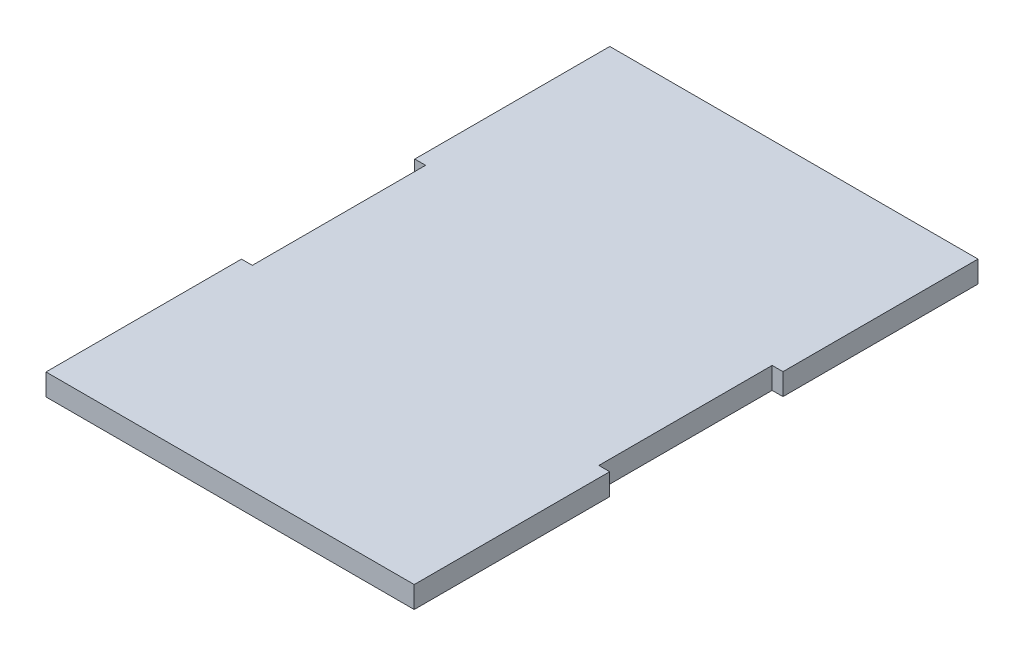
ISO-10303-21;
HEADER;
FILE_DESCRIPTION(('STEP AP214'),'2;1');
FILE_NAME('part.step','',(''),(''),'','','');
FILE_SCHEMA(('AUTOMOTIVE_DESIGN { 1 0 10303 214 1 1 1 1 }'));
ENDSEC;
DATA;
#1=APPLICATION_CONTEXT('core data for automotive mechanical design processes');
#2=APPLICATION_PROTOCOL_DEFINITION('international standard','automotive_design',2000,#1);
#3=PRODUCT_CONTEXT('',#1,'mechanical');
#4=PRODUCT('Part','Part','',(#3));
#5=PRODUCT_RELATED_PRODUCT_CATEGORY('part','',(#4));
#6=PRODUCT_DEFINITION_FORMATION('','',#4);
#7=PRODUCT_DEFINITION_CONTEXT('part definition',#1,'design');
#8=PRODUCT_DEFINITION('design','',#6,#7);
#9=PRODUCT_DEFINITION_SHAPE('','',#8);
#10=(LENGTH_UNIT() NAMED_UNIT(*) SI_UNIT(.MILLI.,.METRE.));
#11=(NAMED_UNIT(*) PLANE_ANGLE_UNIT() SI_UNIT($,.RADIAN.));
#12=(NAMED_UNIT(*) SI_UNIT($,.STERADIAN.) SOLID_ANGLE_UNIT());
#13=UNCERTAINTY_MEASURE_WITH_UNIT(LENGTH_MEASURE(1.E-05),#10,'distance_accuracy_value','');
#14=(GEOMETRIC_REPRESENTATION_CONTEXT(3) GLOBAL_UNCERTAINTY_ASSIGNED_CONTEXT((#13)) GLOBAL_UNIT_ASSIGNED_CONTEXT((#10,
#11,#12)) REPRESENTATION_CONTEXT('',''));
#15=CARTESIAN_POINT('',(0.,0.,0.));
#16=DIRECTION('',(0.,0.,1.));
#17=DIRECTION('',(1.,0.,0.));
#18=AXIS2_PLACEMENT_3D('',#15,#16,#17);
#19=CARTESIAN_POINT('',(0.,1.5875,-6.365875));
#20=DIRECTION('',(0.,0.,1.));
#21=DIRECTION('',(1.,0.,0.));
#22=AXIS2_PLACEMENT_3D('',#19,#20,#21);
#23=PLANE('',#22);
#24=DIRECTION('',(-1.,0.,0.));
#25=VECTOR('',#24,1.);
#26=CARTESIAN_POINT('',(0.,0.,-6.365875));
#27=LINE('',#26,#25);
#28=CARTESIAN_POINT('',(13.49375,0.,-6.365875));
#29=VERTEX_POINT('',#28);
#30=CARTESIAN_POINT('',(12.7,0.,-6.365875));
#31=VERTEX_POINT('',#30);
#32=EDGE_CURVE('E166',#29,#31,#27,.T.);
#33=ORIENTED_EDGE('',*,*,#32,.F.);
#34=DIRECTION('',(0.,-1.,0.));
#35=VECTOR('',#34,1.);
#36=CARTESIAN_POINT('',(13.49375,1.5875,-6.365875));
#37=LINE('',#36,#35);
#38=CARTESIAN_POINT('',(13.49375,1.5875,-6.365875));
#39=VERTEX_POINT('',#38);
#40=EDGE_CURVE('E11',#39,#29,#37,.T.);
#41=ORIENTED_EDGE('',*,*,#40,.F.);
#42=DIRECTION('',(-1.,0.,0.));
#43=VECTOR('',#42,1.);
#44=CARTESIAN_POINT('',(0.,1.5875,-6.365875));
#45=LINE('',#44,#43);
#46=CARTESIAN_POINT('',(12.7,1.5875,-6.365875));
#47=VERTEX_POINT('',#46);
#48=EDGE_CURVE('E203',#39,#47,#45,.T.);
#49=ORIENTED_EDGE('',*,*,#48,.T.);
#50=DIRECTION('',(0.,-1.,0.));
#51=VECTOR('',#50,1.);
#52=CARTESIAN_POINT('',(12.7,1.5875,-6.365875));
#53=LINE('',#52,#51);
#54=EDGE_CURVE('E105',#47,#31,#53,.T.);
#55=ORIENTED_EDGE('',*,*,#54,.T.);
#56=EDGE_LOOP('',(#33,#41,#49,#55));
#57=FACE_BOUND('',#56,.T.);
#58=ADVANCED_FACE('F41',(#57),#23,.T.);
#59=CARTESIAN_POINT('',(13.49375,1.5875,0.));
#60=DIRECTION('',(-1.,0.,0.));
#61=DIRECTION('',(0.,0.,1.));
#62=AXIS2_PLACEMENT_3D('',#59,#60,#61);
#63=PLANE('',#62);
#64=DIRECTION('',(0.,0.,-1.));
#65=VECTOR('',#64,1.);
#66=CARTESIAN_POINT('',(13.49375,0.,0.));
#67=LINE('',#66,#65);
#68=CARTESIAN_POINT('',(13.49375,0.,-20.659725));
#69=VERTEX_POINT('',#68);
#70=EDGE_CURVE('E170',#29,#69,#67,.T.);
#71=ORIENTED_EDGE('',*,*,#70,.T.);
#72=DIRECTION('',(0.,-1.,0.));
#73=VECTOR('',#72,1.);
#74=CARTESIAN_POINT('',(13.49375,1.5875,-20.659725));
#75=LINE('',#74,#73);
#76=CARTESIAN_POINT('',(13.49375,1.5875,-20.659725));
#77=VERTEX_POINT('',#76);
#78=EDGE_CURVE('E50',#77,#69,#75,.T.);
#79=ORIENTED_EDGE('',*,*,#78,.F.);
#80=DIRECTION('',(0.,0.,-1.));
#81=VECTOR('',#80,1.);
#82=CARTESIAN_POINT('',(13.49375,1.5875,0.));
#83=LINE('',#82,#81);
#84=EDGE_CURVE('E149',#39,#77,#83,.T.);
#85=ORIENTED_EDGE('',*,*,#84,.F.);
#86=ORIENTED_EDGE('',*,*,#40,.T.);
#87=EDGE_LOOP('',(#71,#79,#85,#86));
#88=FACE_BOUND('',#87,.T.);
#89=ADVANCED_FACE('F237',(#88),#63,.F.);
#90=CARTESIAN_POINT('',(0.,1.5875,-20.659725));
#91=DIRECTION('',(0.,0.,-1.));
#92=DIRECTION('',(-1.,0.,0.));
#93=AXIS2_PLACEMENT_3D('',#90,#91,#92);
#94=PLANE('',#93);
#95=DIRECTION('',(1.,0.,0.));
#96=VECTOR('',#95,1.);
#97=CARTESIAN_POINT('',(0.,0.,-20.659725));
#98=LINE('',#97,#96);
#99=CARTESIAN_POINT('',(-13.49375,0.,-20.659725));
#100=VERTEX_POINT('',#99);
#101=EDGE_CURVE('E174',#100,#69,#98,.T.);
#102=ORIENTED_EDGE('',*,*,#101,.F.);
#103=DIRECTION('',(0.,-1.,0.));
#104=VECTOR('',#103,1.);
#105=CARTESIAN_POINT('',(-13.49375,1.5875,-20.659725));
#106=LINE('',#105,#104);
#107=CARTESIAN_POINT('',(-13.49375,1.5875,-20.659725));
#108=VERTEX_POINT('',#107);
#109=EDGE_CURVE('E225',#108,#100,#106,.T.);
#110=ORIENTED_EDGE('',*,*,#109,.F.);
#111=DIRECTION('',(1.,0.,0.));
#112=VECTOR('',#111,1.);
#113=CARTESIAN_POINT('',(0.,1.5875,-20.659725));
#114=LINE('',#113,#112);
#115=EDGE_CURVE('E234',#108,#77,#114,.T.);
#116=ORIENTED_EDGE('',*,*,#115,.T.);
#117=ORIENTED_EDGE('',*,*,#78,.T.);
#118=EDGE_LOOP('',(#102,#110,#116,#117));
#119=FACE_BOUND('',#118,.T.);
#120=ADVANCED_FACE('F232',(#119),#94,.T.);
#121=CARTESIAN_POINT('',(-13.49375,1.5875,0.));
#122=DIRECTION('',(-1.,0.,0.));
#123=DIRECTION('',(0.,0.,1.));
#124=AXIS2_PLACEMENT_3D('',#121,#122,#123);
#125=PLANE('',#124);
#126=DIRECTION('',(0.,0.,-1.));
#127=VECTOR('',#126,1.);
#128=CARTESIAN_POINT('',(-13.49375,0.,0.));
#129=LINE('',#128,#127);
#130=CARTESIAN_POINT('',(-13.49375,0.,-6.365875));
#131=VERTEX_POINT('',#130);
#132=EDGE_CURVE('E178',#131,#100,#129,.T.);
#133=ORIENTED_EDGE('',*,*,#132,.F.);
#134=DIRECTION('',(0.,-1.,0.));
#135=VECTOR('',#134,1.);
#136=CARTESIAN_POINT('',(-13.49375,1.5875,-6.365875));
#137=LINE('',#136,#135);
#138=CARTESIAN_POINT('',(-13.49375,1.5875,-6.365875));
#139=VERTEX_POINT('',#138);
#140=EDGE_CURVE('E222',#139,#131,#137,.T.);
#141=ORIENTED_EDGE('',*,*,#140,.F.);
#142=DIRECTION('',(0.,0.,-1.));
#143=VECTOR('',#142,1.);
#144=CARTESIAN_POINT('',(-13.49375,1.5875,0.));
#145=LINE('',#144,#143);
#146=EDGE_CURVE('E247',#139,#108,#145,.T.);
#147=ORIENTED_EDGE('',*,*,#146,.T.);
#148=ORIENTED_EDGE('',*,*,#109,.T.);
#149=EDGE_LOOP('',(#133,#141,#147,#148));
#150=FACE_BOUND('',#149,.T.);
#151=ADVANCED_FACE('F243',(#150),#125,.T.);
#152=CARTESIAN_POINT('',(0.,1.5875,-6.365875));
#153=DIRECTION('',(0.,0.,-1.));
#154=DIRECTION('',(-1.,0.,0.));
#155=AXIS2_PLACEMENT_3D('',#152,#153,#154);
#156=PLANE('',#155);
#157=DIRECTION('',(1.,0.,0.));
#158=VECTOR('',#157,1.);
#159=CARTESIAN_POINT('',(0.,0.,-6.365875));
#160=LINE('',#159,#158);
#161=CARTESIAN_POINT('',(-12.7,0.,-6.365875));
#162=VERTEX_POINT('',#161);
#163=EDGE_CURVE('E182',#131,#162,#160,.T.);
#164=ORIENTED_EDGE('',*,*,#163,.T.);
#165=DIRECTION('',(0.,-1.,0.));
#166=VECTOR('',#165,1.);
#167=CARTESIAN_POINT('',(-12.7,1.5875,-6.365875));
#168=LINE('',#167,#166);
#169=CARTESIAN_POINT('',(-12.7,1.5875,-6.365875));
#170=VERTEX_POINT('',#169);
#171=EDGE_CURVE('E219',#170,#162,#168,.T.);
#172=ORIENTED_EDGE('',*,*,#171,.F.);
#173=DIRECTION('',(1.,0.,0.));
#174=VECTOR('',#173,1.);
#175=CARTESIAN_POINT('',(0.,1.5875,-6.365875));
#176=LINE('',#175,#174);
#177=EDGE_CURVE('E252',#139,#170,#176,.T.);
#178=ORIENTED_EDGE('',*,*,#177,.F.);
#179=ORIENTED_EDGE('',*,*,#140,.T.);
#180=EDGE_LOOP('',(#164,#172,#178,#179));
#181=FACE_BOUND('',#180,.T.);
#182=ADVANCED_FACE('F312',(#181),#156,.F.);
#183=CARTESIAN_POINT('',(-12.7,1.5875,0.));
#184=DIRECTION('',(-1.,0.,0.));
#185=DIRECTION('',(0.,0.,1.));
#186=AXIS2_PLACEMENT_3D('',#183,#184,#185);
#187=PLANE('',#186);
#188=DIRECTION('',(0.,0.,-1.));
#189=VECTOR('',#188,1.);
#190=CARTESIAN_POINT('',(-12.7,0.,0.));
#191=LINE('',#190,#189);
#192=CARTESIAN_POINT('',(-12.7,0.,6.334125));
#193=VERTEX_POINT('',#192);
#194=EDGE_CURVE('E187',#193,#162,#191,.T.);
#195=ORIENTED_EDGE('',*,*,#194,.F.);
#196=DIRECTION('',(0.,-1.,0.));
#197=VECTOR('',#196,1.);
#198=CARTESIAN_POINT('',(-12.7,1.5875,6.334125));
#199=LINE('',#198,#197);
#200=CARTESIAN_POINT('',(-12.7,1.5875,6.334125));
#201=VERTEX_POINT('',#200);
#202=EDGE_CURVE('E216',#201,#193,#199,.T.);
#203=ORIENTED_EDGE('',*,*,#202,.F.);
#204=DIRECTION('',(0.,0.,-1.));
#205=VECTOR('',#204,1.);
#206=CARTESIAN_POINT('',(-12.7,1.5875,0.));
#207=LINE('',#206,#205);
#208=EDGE_CURVE('E259',#201,#170,#207,.T.);
#209=ORIENTED_EDGE('',*,*,#208,.T.);
#210=ORIENTED_EDGE('',*,*,#171,.T.);
#211=EDGE_LOOP('',(#195,#203,#209,#210));
#212=FACE_BOUND('',#211,.T.);
#213=ADVANCED_FACE('F278',(#212),#187,.T.);
#214=CARTESIAN_POINT('',(0.,1.5875,6.334125));
#215=DIRECTION('',(0.,0.,-1.));
#216=DIRECTION('',(-1.,0.,0.));
#217=AXIS2_PLACEMENT_3D('',#214,#215,#216);
#218=PLANE('',#217);
#219=DIRECTION('',(1.,0.,0.));
#220=VECTOR('',#219,1.);
#221=CARTESIAN_POINT('',(0.,0.,6.334125));
#222=LINE('',#221,#220);
#223=CARTESIAN_POINT('',(-13.49375,0.,6.334125));
#224=VERTEX_POINT('',#223);
#225=EDGE_CURVE('E191',#224,#193,#222,.T.);
#226=ORIENTED_EDGE('',*,*,#225,.F.);
#227=DIRECTION('',(0.,-1.,0.));
#228=VECTOR('',#227,1.);
#229=CARTESIAN_POINT('',(-13.49375,1.5875,6.334125));
#230=LINE('',#229,#228);
#231=CARTESIAN_POINT('',(-13.49375,1.5875,6.334125));
#232=VERTEX_POINT('',#231);
#233=EDGE_CURVE('E213',#232,#224,#230,.T.);
#234=ORIENTED_EDGE('',*,*,#233,.F.);
#235=DIRECTION('',(1.,0.,0.));
#236=VECTOR('',#235,1.);
#237=CARTESIAN_POINT('',(0.,1.5875,6.334125));
#238=LINE('',#237,#236);
#239=EDGE_CURVE('E262',#232,#201,#238,.T.);
#240=ORIENTED_EDGE('',*,*,#239,.T.);
#241=ORIENTED_EDGE('',*,*,#202,.T.);
#242=EDGE_LOOP('',(#226,#234,#240,#241));
#243=FACE_BOUND('',#242,.T.);
#244=ADVANCED_FACE('F279',(#243),#218,.T.);
#245=CARTESIAN_POINT('',(-13.49375,0.,20.659725));
#246=VERTEX_POINT('',#245);
#247=EDGE_CURVE('E183',#246,#224,#129,.T.);
#248=ORIENTED_EDGE('',*,*,#247,.F.);
#249=DIRECTION('',(0.,-1.,0.));
#250=VECTOR('',#249,1.);
#251=CARTESIAN_POINT('',(-13.49375,1.5875,20.659725));
#252=LINE('',#251,#250);
#253=CARTESIAN_POINT('',(-13.49375,1.5875,20.659725));
#254=VERTEX_POINT('',#253);
#255=EDGE_CURVE('E210',#254,#246,#252,.T.);
#256=ORIENTED_EDGE('',*,*,#255,.F.);
#257=EDGE_CURVE('E254',#254,#232,#145,.T.);
#258=ORIENTED_EDGE('',*,*,#257,.T.);
#259=ORIENTED_EDGE('',*,*,#233,.T.);
#260=EDGE_LOOP('',(#248,#256,#258,#259));
#261=FACE_BOUND('',#260,.T.);
#262=ADVANCED_FACE('F272',(#261),#125,.T.);
#263=CARTESIAN_POINT('',(0.,1.5875,20.659725));
#264=DIRECTION('',(0.,0.,-1.));
#265=DIRECTION('',(-1.,0.,0.));
#266=AXIS2_PLACEMENT_3D('',#263,#264,#265);
#267=PLANE('',#266);
#268=DIRECTION('',(1.,0.,0.));
#269=VECTOR('',#268,1.);
#270=CARTESIAN_POINT('',(0.,0.,20.659725));
#271=LINE('',#270,#269);
#272=CARTESIAN_POINT('',(13.49375,0.,20.659725));
#273=VERTEX_POINT('',#272);
#274=EDGE_CURVE('E195',#246,#273,#271,.T.);
#275=ORIENTED_EDGE('',*,*,#274,.T.);
#276=DIRECTION('',(0.,-1.,0.));
#277=VECTOR('',#276,1.);
#278=CARTESIAN_POINT('',(13.49375,1.5875,20.659725));
#279=LINE('',#278,#277);
#280=CARTESIAN_POINT('',(13.49375,1.5875,20.659725));
#281=VERTEX_POINT('',#280);
#282=EDGE_CURVE('E155',#281,#273,#279,.T.);
#283=ORIENTED_EDGE('',*,*,#282,.F.);
#284=DIRECTION('',(1.,0.,0.));
#285=VECTOR('',#284,1.);
#286=CARTESIAN_POINT('',(0.,1.5875,20.659725));
#287=LINE('',#286,#285);
#288=EDGE_CURVE('E143',#254,#281,#287,.T.);
#289=ORIENTED_EDGE('',*,*,#288,.F.);
#290=ORIENTED_EDGE('',*,*,#255,.T.);
#291=EDGE_LOOP('',(#275,#283,#289,#290));
#292=FACE_BOUND('',#291,.T.);
#293=ADVANCED_FACE('F296',(#292),#267,.F.);
#294=CARTESIAN_POINT('',(13.49375,0.,6.334125));
#295=VERTEX_POINT('',#294);
#296=EDGE_CURVE('E153',#273,#295,#67,.T.);
#297=ORIENTED_EDGE('',*,*,#296,.T.);
#298=DIRECTION('',(0.,-1.,0.));
#299=VECTOR('',#298,1.);
#300=CARTESIAN_POINT('',(13.49375,1.5875,6.334125));
#301=LINE('',#300,#299);
#302=CARTESIAN_POINT('',(13.49375,1.5875,6.334125));
#303=VERTEX_POINT('',#302);
#304=EDGE_CURVE('E150',#303,#295,#301,.T.);
#305=ORIENTED_EDGE('',*,*,#304,.F.);
#306=EDGE_CURVE('E136',#281,#303,#83,.T.);
#307=ORIENTED_EDGE('',*,*,#306,.F.);
#308=ORIENTED_EDGE('',*,*,#282,.T.);
#309=EDGE_LOOP('',(#297,#305,#307,#308));
#310=FACE_BOUND('',#309,.T.);
#311=ADVANCED_FACE('F151',(#310),#63,.F.);
#312=CARTESIAN_POINT('',(0.,1.5875,6.334125));
#313=DIRECTION('',(0.,0.,1.));
#314=DIRECTION('',(1.,0.,0.));
#315=AXIS2_PLACEMENT_3D('',#312,#313,#314);
#316=PLANE('',#315);
#317=DIRECTION('',(-1.,0.,0.));
#318=VECTOR('',#317,1.);
#319=CARTESIAN_POINT('',(0.,0.,6.334125));
#320=LINE('',#319,#318);
#321=CARTESIAN_POINT('',(12.7,0.,6.334125));
#322=VERTEX_POINT('',#321);
#323=EDGE_CURVE('E98',#295,#322,#320,.T.);
#324=ORIENTED_EDGE('',*,*,#323,.T.);
#325=DIRECTION('',(0.,-1.,0.));
#326=VECTOR('',#325,1.);
#327=CARTESIAN_POINT('',(12.7,1.5875,6.334125));
#328=LINE('',#327,#326);
#329=CARTESIAN_POINT('',(12.7,1.5875,6.334125));
#330=VERTEX_POINT('',#329);
#331=EDGE_CURVE('E156',#330,#322,#328,.T.);
#332=ORIENTED_EDGE('',*,*,#331,.F.);
#333=DIRECTION('',(-1.,0.,0.));
#334=VECTOR('',#333,1.);
#335=CARTESIAN_POINT('',(0.,1.5875,6.334125));
#336=LINE('',#335,#334);
#337=EDGE_CURVE('E140',#303,#330,#336,.T.);
#338=ORIENTED_EDGE('',*,*,#337,.F.);
#339=ORIENTED_EDGE('',*,*,#304,.T.);
#340=EDGE_LOOP('',(#324,#332,#338,#339));
#341=FACE_BOUND('',#340,.T.);
#342=ADVANCED_FACE('F158',(#341),#316,.F.);
#343=CARTESIAN_POINT('',(12.7,1.5875,0.));
#344=DIRECTION('',(-1.,0.,0.));
#345=DIRECTION('',(0.,0.,1.));
#346=AXIS2_PLACEMENT_3D('',#343,#344,#345);
#347=PLANE('',#346);
#348=DIRECTION('',(0.,0.,-1.));
#349=VECTOR('',#348,1.);
#350=CARTESIAN_POINT('',(12.7,0.,0.));
#351=LINE('',#350,#349);
#352=EDGE_CURVE('E200',#322,#31,#351,.T.);
#353=ORIENTED_EDGE('',*,*,#352,.T.);
#354=ORIENTED_EDGE('',*,*,#54,.F.);
#355=DIRECTION('',(0.,0.,-1.));
#356=VECTOR('',#355,1.);
#357=CARTESIAN_POINT('',(12.7,1.5875,0.));
#358=LINE('',#357,#356);
#359=EDGE_CURVE('E58',#330,#47,#358,.T.);
#360=ORIENTED_EDGE('',*,*,#359,.F.);
#361=ORIENTED_EDGE('',*,*,#331,.T.);
#362=EDGE_LOOP('',(#353,#354,#360,#361));
#363=FACE_BOUND('',#362,.T.);
#364=ADVANCED_FACE('F301',(#363),#347,.F.);
#365=CARTESIAN_POINT('',(0.,1.5875,0.));
#366=DIRECTION('',(0.,1.,0.));
#367=DIRECTION('',(0.,0.,1.));
#368=AXIS2_PLACEMENT_3D('',#365,#366,#367);
#369=PLANE('',#368);
#370=ORIENTED_EDGE('',*,*,#48,.F.);
#371=ORIENTED_EDGE('',*,*,#84,.T.);
#372=ORIENTED_EDGE('',*,*,#115,.F.);
#373=ORIENTED_EDGE('',*,*,#146,.F.);
#374=ORIENTED_EDGE('',*,*,#177,.T.);
#375=ORIENTED_EDGE('',*,*,#208,.F.);
#376=ORIENTED_EDGE('',*,*,#239,.F.);
#377=ORIENTED_EDGE('',*,*,#257,.F.);
#378=ORIENTED_EDGE('',*,*,#288,.T.);
#379=ORIENTED_EDGE('',*,*,#306,.T.);
#380=ORIENTED_EDGE('',*,*,#337,.T.);
#381=ORIENTED_EDGE('',*,*,#359,.T.);
#382=EDGE_LOOP('',(#370,#371,#372,#373,#374,#375,#376,#377,#378,#379,#380,#381));
#383=FACE_BOUND('',#382,.T.);
#384=ADVANCED_FACE('F138',(#383),#369,.T.);
#385=CARTESIAN_POINT('',(0.,0.,0.));
#386=DIRECTION('',(0.,1.,0.));
#387=DIRECTION('',(0.,0.,1.));
#388=AXIS2_PLACEMENT_3D('',#385,#386,#387);
#389=PLANE('',#388);
#390=ORIENTED_EDGE('',*,*,#32,.T.);
#391=ORIENTED_EDGE('',*,*,#352,.F.);
#392=ORIENTED_EDGE('',*,*,#323,.F.);
#393=ORIENTED_EDGE('',*,*,#296,.F.);
#394=ORIENTED_EDGE('',*,*,#274,.F.);
#395=ORIENTED_EDGE('',*,*,#247,.T.);
#396=ORIENTED_EDGE('',*,*,#225,.T.);
#397=ORIENTED_EDGE('',*,*,#194,.T.);
#398=ORIENTED_EDGE('',*,*,#163,.F.);
#399=ORIENTED_EDGE('',*,*,#132,.T.);
#400=ORIENTED_EDGE('',*,*,#101,.T.);
#401=ORIENTED_EDGE('',*,*,#70,.F.);
#402=EDGE_LOOP('',(#390,#391,#392,#393,#394,#395,#396,#397,#398,#399,#400,#401));
#403=FACE_BOUND('',#402,.T.);
#404=ADVANCED_FACE('F239',(#403),#389,.F.);
#405=CLOSED_SHELL('',(#58,#89,#120,#151,#182,#213,#244,#262,#293,#311,#342,#364,#384,#404));
#406=MANIFOLD_SOLID_BREP('B2',#405);
#407=ADVANCED_BREP_SHAPE_REPRESENTATION('',(#18,#406),#14);
#408=SHAPE_DEFINITION_REPRESENTATION(#9,#407);
ENDSEC;
END-ISO-10303-21;
